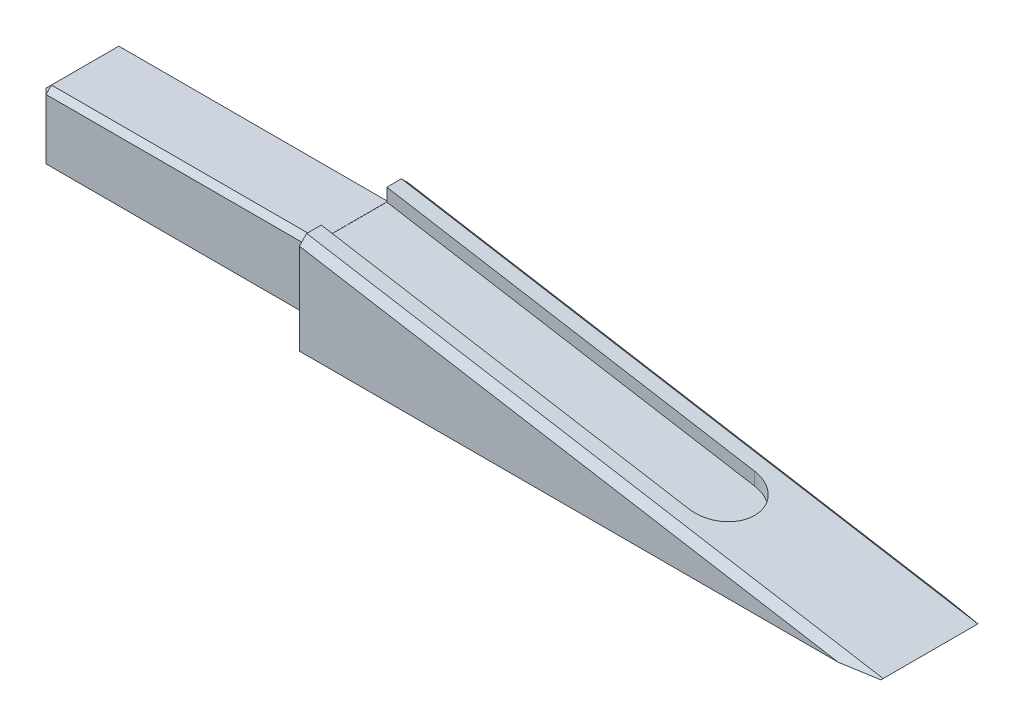
ISO-10303-21;
HEADER;
FILE_DESCRIPTION(('STEP AP214'),'2;1');
FILE_NAME('part.step','',(''),(''),'','','');
FILE_SCHEMA(('AUTOMOTIVE_DESIGN { 1 0 10303 214 1 1 1 1 }'));
ENDSEC;
DATA;
#1=APPLICATION_CONTEXT('core data for automotive mechanical design processes');
#2=APPLICATION_PROTOCOL_DEFINITION('international standard','automotive_design',2000,#1);
#3=PRODUCT_CONTEXT('',#1,'mechanical');
#4=PRODUCT('Part','Part','',(#3));
#5=PRODUCT_RELATED_PRODUCT_CATEGORY('part','',(#4));
#6=PRODUCT_DEFINITION_FORMATION('','',#4);
#7=PRODUCT_DEFINITION_CONTEXT('part definition',#1,'design');
#8=PRODUCT_DEFINITION('design','',#6,#7);
#9=PRODUCT_DEFINITION_SHAPE('','',#8);
#10=(LENGTH_UNIT() NAMED_UNIT(*) SI_UNIT(.MILLI.,.METRE.));
#11=(NAMED_UNIT(*) PLANE_ANGLE_UNIT() SI_UNIT($,.RADIAN.));
#12=(NAMED_UNIT(*) SI_UNIT($,.STERADIAN.) SOLID_ANGLE_UNIT());
#13=UNCERTAINTY_MEASURE_WITH_UNIT(LENGTH_MEASURE(1.E-05),#10,'distance_accuracy_value','');
#14=(GEOMETRIC_REPRESENTATION_CONTEXT(3) GLOBAL_UNCERTAINTY_ASSIGNED_CONTEXT((#13)) GLOBAL_UNIT_ASSIGNED_CONTEXT((#10,
#11,#12)) REPRESENTATION_CONTEXT('',''));
#15=CARTESIAN_POINT('',(0.,0.,0.));
#16=DIRECTION('',(0.,0.,1.));
#17=DIRECTION('',(1.,0.,0.));
#18=AXIS2_PLACEMENT_3D('',#15,#16,#17);
#19=CARTESIAN_POINT('',(50.5,3.2033829137643,0.));
#20=DIRECTION('',(0.,-1.,0.));
#21=DIRECTION('',(0.,0.,-1.));
#22=AXIS2_PLACEMENT_3D('',#19,#20,#21);
#23=CYLINDRICAL_SURFACE('',#22,4.5);
#24=DIRECTION('',(0.,1.,0.));
#25=VECTOR('',#24,1.);
#26=CARTESIAN_POINT('',(50.5,3.2033829137643,-4.5));
#27=LINE('',#26,#25);
#28=CARTESIAN_POINT('',(50.5,3.2033829137643,-4.5));
#29=VERTEX_POINT('',#28);
#30=CARTESIAN_POINT('',(50.5,4.978125,-4.5));
#31=VERTEX_POINT('',#30);
#32=EDGE_CURVE('E199',#29,#31,#27,.T.);
#33=ORIENTED_EDGE('',*,*,#32,.F.);
#34=CARTESIAN_POINT('',(50.5,3.2033829137643,0.));
#35=DIRECTION('',(-0.166397417568639,-0.986058770777122,0.));
#36=DIRECTION('',(0.986058770777122,-0.166397417568639,0.));
#37=AXIS2_PLACEMENT_3D('',#34,#35,#36);
#38=ELLIPSE('',#37,4.56362250746323,4.5);
#39=CARTESIAN_POINT('',(50.5,3.2033829137643,4.5));
#40=VERTEX_POINT('',#39);
#41=EDGE_CURVE('E246',#40,#29,#38,.F.);
#42=ORIENTED_EDGE('',*,*,#41,.F.);
#43=DIRECTION('',(0.,-1.,0.));
#44=VECTOR('',#43,1.);
#45=CARTESIAN_POINT('',(50.5,0.,4.5));
#46=LINE('',#45,#44);
#47=CARTESIAN_POINT('',(50.5,4.978125,4.5));
#48=VERTEX_POINT('',#47);
#49=EDGE_CURVE('E242',#48,#40,#46,.T.);
#50=ORIENTED_EDGE('',*,*,#49,.F.);
#51=CARTESIAN_POINT('',(50.5,4.978125,0.));
#52=DIRECTION('',(-0.166397417568639,-0.986058770777122,0.));
#53=DIRECTION('',(0.986058770777122,-0.166397417568639,0.));
#54=AXIS2_PLACEMENT_3D('',#51,#52,#53);
#55=ELLIPSE('',#54,4.56362250746323,4.5);
#56=EDGE_CURVE('E249',#48,#31,#55,.F.);
#57=ORIENTED_EDGE('',*,*,#56,.T.);
#58=EDGE_LOOP('',(#33,#42,#50,#57));
#59=FACE_BOUND('',#58,.T.);
#60=ADVANCED_FACE('F47',(#59),#23,.F.);
#61=CARTESIAN_POINT('',(0.,0.,7.5));
#62=DIRECTION('',(1.,0.,0.));
#63=DIRECTION('',(0.,0.,-1.));
#64=AXIS2_PLACEMENT_3D('',#61,#62,#63);
#65=PLANE('',#64);
#66=DIRECTION('',(0.,0.,-1.));
#67=VECTOR('',#66,1.);
#68=CARTESIAN_POINT('',(0.,13.5,7.5));
#69=LINE('',#68,#67);
#70=CARTESIAN_POINT('',(0.,13.5,-4.5));
#71=VERTEX_POINT('',#70);
#72=CARTESIAN_POINT('',(0.,13.5,-6.5));
#73=VERTEX_POINT('',#72);
#74=EDGE_CURVE('E210',#71,#73,#69,.T.);
#75=ORIENTED_EDGE('',*,*,#74,.T.);
#76=DIRECTION('',(0.,-0.712052806532872,-0.702125915138204));
#77=VECTOR('',#76,1.);
#78=CARTESIAN_POINT('',(0.,13.5,-6.5));
#79=LINE('',#78,#77);
#80=CARTESIAN_POINT('',(0.,12.4858616650082,-7.5));
#81=VERTEX_POINT('',#80);
#82=EDGE_CURVE('E272',#73,#81,#79,.T.);
#83=ORIENTED_EDGE('',*,*,#82,.T.);
#84=DIRECTION('',(0.,-1.,0.));
#85=VECTOR('',#84,1.);
#86=CARTESIAN_POINT('',(0.,0.,-7.5));
#87=LINE('',#86,#85);
#88=CARTESIAN_POINT('',(0.,0.,-7.5));
#89=VERTEX_POINT('',#88);
#90=EDGE_CURVE('E427',#81,#89,#87,.T.);
#91=ORIENTED_EDGE('',*,*,#90,.T.);
#92=DIRECTION('',(0.,0.,-1.));
#93=VECTOR('',#92,1.);
#94=CARTESIAN_POINT('',(0.,0.,7.5));
#95=LINE('',#94,#93);
#96=CARTESIAN_POINT('',(0.,0.,7.5));
#97=VERTEX_POINT('',#96);
#98=EDGE_CURVE('E228',#97,#89,#95,.T.);
#99=ORIENTED_EDGE('',*,*,#98,.F.);
#100=DIRECTION('',(0.,-1.,0.));
#101=VECTOR('',#100,1.);
#102=CARTESIAN_POINT('',(0.,0.,7.5));
#103=LINE('',#102,#101);
#104=CARTESIAN_POINT('',(0.,12.4858616650082,7.5));
#105=VERTEX_POINT('',#104);
#106=EDGE_CURVE('E231',#105,#97,#103,.T.);
#107=ORIENTED_EDGE('',*,*,#106,.F.);
#108=DIRECTION('',(0.,-0.712052806532872,0.702125915138204));
#109=VECTOR('',#108,1.);
#110=CARTESIAN_POINT('',(0.,12.3105801623066,7.6728378630939));
#111=LINE('',#110,#109);
#112=CARTESIAN_POINT('',(0.,13.5,6.5));
#113=VERTEX_POINT('',#112);
#114=EDGE_CURVE('E269',#105,#113,#111,.F.);
#115=ORIENTED_EDGE('',*,*,#114,.T.);
#116=CARTESIAN_POINT('',(0.,13.5,4.5));
#117=VERTEX_POINT('',#116);
#118=EDGE_CURVE('E222',#113,#117,#69,.T.);
#119=ORIENTED_EDGE('',*,*,#118,.T.);
#120=DIRECTION('',(0.,-1.,0.));
#121=VECTOR('',#120,1.);
#122=CARTESIAN_POINT('',(0.,0.,4.5));
#123=LINE('',#122,#121);
#124=CARTESIAN_POINT('',(0.,11.75,4.5));
#125=VERTEX_POINT('',#124);
#126=EDGE_CURVE('E425',#117,#125,#123,.T.);
#127=ORIENTED_EDGE('',*,*,#126,.T.);
#128=DIRECTION('',(0.,0.,-1.));
#129=VECTOR('',#128,1.);
#130=CARTESIAN_POINT('',(0.,11.75,-5.375));
#131=LINE('',#130,#129);
#132=CARTESIAN_POINT('',(0.,11.75,4.625));
#133=VERTEX_POINT('',#132);
#134=EDGE_CURVE('E419',#133,#125,#131,.T.);
#135=ORIENTED_EDGE('',*,*,#134,.F.);
#136=DIRECTION('',(0.,0.707106781186548,-0.707106781186548));
#137=VECTOR('',#136,1.);
#138=CARTESIAN_POINT('',(0.,4.4375,11.9375));
#139=LINE('',#138,#137);
#140=CARTESIAN_POINT('',(0.,11.,5.375));
#141=VERTEX_POINT('',#140);
#142=EDGE_CURVE('E58',#133,#141,#139,.F.);
#143=ORIENTED_EDGE('',*,*,#142,.T.);
#144=DIRECTION('',(0.,1.,0.));
#145=VECTOR('',#144,1.);
#146=CARTESIAN_POINT('',(0.,2.,5.375));
#147=LINE('',#146,#145);
#148=CARTESIAN_POINT('',(0.,2.75,5.375));
#149=VERTEX_POINT('',#148);
#150=EDGE_CURVE('E436',#149,#141,#147,.T.);
#151=ORIENTED_EDGE('',*,*,#150,.F.);
#152=DIRECTION('',(0.,0.707106781186548,0.707106781186548));
#153=VECTOR('',#152,1.);
#154=CARTESIAN_POINT('',(0.,2.4375,5.0625));
#155=LINE('',#154,#153);
#156=CARTESIAN_POINT('',(0.,2.,4.625));
#157=VERTEX_POINT('',#156);
#158=EDGE_CURVE('E340',#149,#157,#155,.F.);
#159=ORIENTED_EDGE('',*,*,#158,.T.);
#160=DIRECTION('',(0.,0.,1.));
#161=VECTOR('',#160,1.);
#162=CARTESIAN_POINT('',(0.,2.,-5.375));
#163=LINE('',#162,#161);
#164=CARTESIAN_POINT('',(0.,2.,-4.625));
#165=VERTEX_POINT('',#164);
#166=EDGE_CURVE('E437',#165,#157,#163,.T.);
#167=ORIENTED_EDGE('',*,*,#166,.F.);
#168=DIRECTION('',(0.,-0.707106781186548,0.707106781186548));
#169=VECTOR('',#168,1.);
#170=CARTESIAN_POINT('',(0.,-5.0625,2.4375));
#171=LINE('',#170,#169);
#172=CARTESIAN_POINT('',(0.,2.75,-5.375));
#173=VERTEX_POINT('',#172);
#174=EDGE_CURVE('E337',#165,#173,#171,.F.);
#175=ORIENTED_EDGE('',*,*,#174,.T.);
#176=DIRECTION('',(0.,-1.,0.));
#177=VECTOR('',#176,1.);
#178=CARTESIAN_POINT('',(0.,2.,-5.375));
#179=LINE('',#178,#177);
#180=CARTESIAN_POINT('',(0.,11.,-5.375));
#181=VERTEX_POINT('',#180);
#182=EDGE_CURVE('E442',#181,#173,#179,.T.);
#183=ORIENTED_EDGE('',*,*,#182,.F.);
#184=DIRECTION('',(0.,-0.707106781186548,-0.707106781186548));
#185=VECTOR('',#184,1.);
#186=CARTESIAN_POINT('',(0.,11.9375,-4.4375));
#187=LINE('',#186,#185);
#188=CARTESIAN_POINT('',(0.,11.75,-4.625));
#189=VERTEX_POINT('',#188);
#190=EDGE_CURVE('E11',#181,#189,#187,.F.);
#191=ORIENTED_EDGE('',*,*,#190,.T.);
#192=CARTESIAN_POINT('',(0.,11.75,-4.5));
#193=VERTEX_POINT('',#192);
#194=EDGE_CURVE('E212',#193,#189,#131,.T.);
#195=ORIENTED_EDGE('',*,*,#194,.F.);
#196=DIRECTION('',(0.,-1.,0.));
#197=VECTOR('',#196,1.);
#198=CARTESIAN_POINT('',(0.,0.,-4.5));
#199=LINE('',#198,#197);
#200=EDGE_CURVE('E196',#71,#193,#199,.T.);
#201=ORIENTED_EDGE('',*,*,#200,.F.);
#202=EDGE_LOOP('',(#75,#83,#91,#99,#107,#115,#119,#127,#135,#143,#151,#159,#167,#175,#183,#191,
#195,#201));
#203=FACE_BOUND('',#202,.T.);
#204=ADVANCED_FACE('F209',(#203),#65,.F.);
#205=CARTESIAN_POINT('',(0.,13.5,7.5));
#206=DIRECTION('',(-0.166397417568639,-0.986058770777122,0.));
#207=DIRECTION('',(0.986058770777122,-0.166397417568639,0.));
#208=AXIS2_PLACEMENT_3D('',#205,#206,#207);
#209=PLANE('',#208);
#210=DIRECTION('',(0.,0.,-1.));
#211=VECTOR('',#210,1.);
#212=CARTESIAN_POINT('',(79.144385026738,0.144385026737954,7.5));
#213=LINE('',#212,#211);
#214=CARTESIAN_POINT('',(79.144385026738,0.144385026737953,6.5));
#215=VERTEX_POINT('',#214);
#216=CARTESIAN_POINT('',(79.144385026738,0.144385026737953,-6.5));
#217=VERTEX_POINT('',#216);
#218=EDGE_CURVE('E255',#215,#217,#213,.T.);
#219=ORIENTED_EDGE('',*,*,#218,.T.);
#220=DIRECTION('',(-0.986058770777122,0.166397417568639,0.));
#221=VECTOR('',#220,1.);
#222=CARTESIAN_POINT('',(0.,13.5,-6.5));
#223=LINE('',#222,#221);
#224=EDGE_CURVE('E220',#217,#73,#223,.T.);
#225=ORIENTED_EDGE('',*,*,#224,.T.);
#226=ORIENTED_EDGE('',*,*,#74,.F.);
#227=DIRECTION('',(-0.986058770777122,0.166397417568639,0.));
#228=VECTOR('',#227,1.);
#229=CARTESIAN_POINT('',(2.21504804588097,13.1262106422576,-4.5));
#230=LINE('',#229,#228);
#231=EDGE_CURVE('E192',#31,#71,#230,.T.);
#232=ORIENTED_EDGE('',*,*,#231,.F.);
#233=ORIENTED_EDGE('',*,*,#56,.F.);
#234=DIRECTION('',(-0.986058770777122,0.166397417568639,0.));
#235=VECTOR('',#234,1.);
#236=CARTESIAN_POINT('',(2.21504804588097,13.1262106422576,4.5));
#237=LINE('',#236,#235);
#238=EDGE_CURVE('E289',#48,#117,#237,.T.);
#239=ORIENTED_EDGE('',*,*,#238,.T.);
#240=ORIENTED_EDGE('',*,*,#118,.F.);
#241=DIRECTION('',(0.986058770777122,-0.166397417568639,0.));
#242=VECTOR('',#241,1.);
#243=CARTESIAN_POINT('',(0.,13.5,6.5));
#244=LINE('',#243,#242);
#245=EDGE_CURVE('E252',#113,#215,#244,.T.);
#246=ORIENTED_EDGE('',*,*,#245,.T.);
#247=EDGE_LOOP('',(#219,#225,#226,#232,#233,#239,#240,#246));
#248=FACE_BOUND('',#247,.T.);
#249=ADVANCED_FACE('F218',(#248),#209,.F.);
#250=CARTESIAN_POINT('',(0.,0.,7.5));
#251=DIRECTION('',(0.,1.,0.));
#252=DIRECTION('',(0.,0.,1.));
#253=AXIS2_PLACEMENT_3D('',#250,#251,#252);
#254=PLANE('',#253);
#255=DIRECTION('',(1.,0.,0.));
#256=VECTOR('',#255,1.);
#257=CARTESIAN_POINT('',(0.,0.,-7.5));
#258=LINE('',#257,#256);
#259=CARTESIAN_POINT('',(73.9902913481966,0.,-7.5));
#260=VERTEX_POINT('',#259);
#261=EDGE_CURVE('E235',#89,#260,#258,.T.);
#262=ORIENTED_EDGE('',*,*,#261,.T.);
#263=DIRECTION('',(0.986436959807608,0.,0.164140562706246));
#264=VECTOR('',#263,1.);
#265=CARTESIAN_POINT('',(2.15536994604184,0.,-19.4531454125647));
#266=LINE('',#265,#264);
#267=CARTESIAN_POINT('',(79.0000000000001,0.,-6.66639741756863));
#268=VERTEX_POINT('',#267);
#269=EDGE_CURVE('E266',#260,#268,#266,.T.);
#270=ORIENTED_EDGE('',*,*,#269,.T.);
#271=DIRECTION('',(0.,0.,1.));
#272=VECTOR('',#271,1.);
#273=CARTESIAN_POINT('',(79.0000000000001,0.,7.5));
#274=LINE('',#273,#272);
#275=CARTESIAN_POINT('',(79.0000000000001,0.,6.66639741756863));
#276=VERTEX_POINT('',#275);
#277=EDGE_CURVE('E263',#268,#276,#274,.T.);
#278=ORIENTED_EDGE('',*,*,#277,.T.);
#279=DIRECTION('',(0.986436959807608,0.,-0.164140562706246));
#280=VECTOR('',#279,1.);
#281=CARTESIAN_POINT('',(3.98691125676955,0.,19.1483816682893));
#282=LINE('',#281,#280);
#283=CARTESIAN_POINT('',(73.9902913481966,0.,7.5));
#284=VERTEX_POINT('',#283);
#285=EDGE_CURVE('E260',#276,#284,#282,.F.);
#286=ORIENTED_EDGE('',*,*,#285,.T.);
#287=DIRECTION('',(1.,0.,0.));
#288=VECTOR('',#287,1.);
#289=CARTESIAN_POINT('',(0.,0.,7.5));
#290=LINE('',#289,#288);
#291=EDGE_CURVE('E223',#97,#284,#290,.T.);
#292=ORIENTED_EDGE('',*,*,#291,.F.);
#293=ORIENTED_EDGE('',*,*,#98,.T.);
#294=EDGE_LOOP('',(#262,#270,#278,#286,#292,#293));
#295=FACE_BOUND('',#294,.T.);
#296=ADVANCED_FACE('F614',(#295),#254,.F.);
#297=CARTESIAN_POINT('',(0.,0.,7.5));
#298=DIRECTION('',(0.,0.,-1.));
#299=DIRECTION('',(-1.,0.,0.));
#300=AXIS2_PLACEMENT_3D('',#297,#298,#299);
#301=PLANE('',#300);
#302=ORIENTED_EDGE('',*,*,#291,.T.);
#303=DIRECTION('',(-0.986058770777122,0.166397417568639,0.));
#304=VECTOR('',#303,1.);
#305=CARTESIAN_POINT('',(2.04865062831233,12.1401518714805,7.5));
#306=LINE('',#305,#304);
#307=EDGE_CURVE('E278',#284,#105,#306,.T.);
#308=ORIENTED_EDGE('',*,*,#307,.T.);
#309=ORIENTED_EDGE('',*,*,#106,.T.);
#310=EDGE_LOOP('',(#302,#308,#309));
#311=FACE_BOUND('',#310,.T.);
#312=ADVANCED_FACE('F611',(#311),#301,.F.);
#313=CARTESIAN_POINT('',(0.,0.,-7.5));
#314=DIRECTION('',(0.,0.,-1.));
#315=DIRECTION('',(-1.,0.,0.));
#316=AXIS2_PLACEMENT_3D('',#313,#314,#315);
#317=PLANE('',#316);
#318=ORIENTED_EDGE('',*,*,#90,.F.);
#319=DIRECTION('',(0.986058770777122,-0.166397417568639,0.));
#320=VECTOR('',#319,1.);
#321=CARTESIAN_POINT('',(79.8336025824314,-0.986058770777123,-7.5));
#322=LINE('',#321,#320);
#323=EDGE_CURVE('E275',#81,#260,#322,.T.);
#324=ORIENTED_EDGE('',*,*,#323,.T.);
#325=ORIENTED_EDGE('',*,*,#261,.F.);
#326=EDGE_LOOP('',(#318,#324,#325));
#327=FACE_BOUND('',#326,.T.);
#328=ADVANCED_FACE('F607',(#327),#317,.T.);
#329=CARTESIAN_POINT('',(-37.67,2.,-5.375));
#330=DIRECTION('',(0.,0.,1.));
#331=DIRECTION('',(1.,0.,0.));
#332=AXIS2_PLACEMENT_3D('',#329,#330,#331);
#333=PLANE('',#332);
#334=ORIENTED_EDGE('',*,*,#182,.T.);
#335=DIRECTION('',(-1.,0.,0.));
#336=VECTOR('',#335,1.);
#337=CARTESIAN_POINT('',(-37.67,2.75,-5.375));
#338=LINE('',#337,#336);
#339=CARTESIAN_POINT('',(-36.92,2.75,-5.375));
#340=VERTEX_POINT('',#339);
#341=EDGE_CURVE('E318',#173,#340,#338,.T.);
#342=ORIENTED_EDGE('',*,*,#341,.T.);
#343=DIRECTION('',(0.,1.,0.));
#344=VECTOR('',#343,1.);
#345=CARTESIAN_POINT('',(-36.92,2.,-5.375));
#346=LINE('',#345,#344);
#347=CARTESIAN_POINT('',(-36.92,11.,-5.375));
#348=VERTEX_POINT('',#347);
#349=EDGE_CURVE('E315',#340,#348,#346,.T.);
#350=ORIENTED_EDGE('',*,*,#349,.T.);
#351=DIRECTION('',(1.,0.,0.));
#352=VECTOR('',#351,1.);
#353=CARTESIAN_POINT('',(-37.67,11.,-5.375));
#354=LINE('',#353,#352);
#355=EDGE_CURVE('E312',#348,#181,#354,.T.);
#356=ORIENTED_EDGE('',*,*,#355,.T.);
#357=EDGE_LOOP('',(#334,#342,#350,#356));
#358=FACE_BOUND('',#357,.T.);
#359=ADVANCED_FACE('F589',(#358),#333,.F.);
#360=CARTESIAN_POINT('',(-37.67,2.,-5.375));
#361=DIRECTION('',(0.,1.,0.));
#362=DIRECTION('',(0.,0.,1.));
#363=AXIS2_PLACEMENT_3D('',#360,#361,#362);
#364=PLANE('',#363);
#365=DIRECTION('',(0.,0.,-1.));
#366=VECTOR('',#365,1.);
#367=CARTESIAN_POINT('',(-36.92,2.,-5.375));
#368=LINE('',#367,#366);
#369=CARTESIAN_POINT('',(-36.92,2.,4.625));
#370=VERTEX_POINT('',#369);
#371=CARTESIAN_POINT('',(-36.92,2.,-4.625));
#372=VERTEX_POINT('',#371);
#373=EDGE_CURVE('E305',#370,#372,#368,.T.);
#374=ORIENTED_EDGE('',*,*,#373,.T.);
#375=DIRECTION('',(1.,0.,0.));
#376=VECTOR('',#375,1.);
#377=CARTESIAN_POINT('',(-37.67,2.,-4.625));
#378=LINE('',#377,#376);
#379=EDGE_CURVE('E309',#372,#165,#378,.T.);
#380=ORIENTED_EDGE('',*,*,#379,.T.);
#381=ORIENTED_EDGE('',*,*,#166,.T.);
#382=DIRECTION('',(-1.,0.,0.));
#383=VECTOR('',#382,1.);
#384=CARTESIAN_POINT('',(-37.67,2.,4.625));
#385=LINE('',#384,#383);
#386=EDGE_CURVE('E302',#157,#370,#385,.T.);
#387=ORIENTED_EDGE('',*,*,#386,.T.);
#388=EDGE_LOOP('',(#374,#380,#381,#387));
#389=FACE_BOUND('',#388,.T.);
#390=ADVANCED_FACE('F600',(#389),#364,.F.);
#391=CARTESIAN_POINT('',(-37.67,2.,5.375));
#392=DIRECTION('',(0.,0.,-1.));
#393=DIRECTION('',(-1.,0.,0.));
#394=AXIS2_PLACEMENT_3D('',#391,#392,#393);
#395=PLANE('',#394);
#396=DIRECTION('',(0.,-1.,0.));
#397=VECTOR('',#396,1.);
#398=CARTESIAN_POINT('',(-36.92,2.,5.375));
#399=LINE('',#398,#397);
#400=CARTESIAN_POINT('',(-36.92,11.,5.375));
#401=VERTEX_POINT('',#400);
#402=CARTESIAN_POINT('',(-36.92,2.75,5.375));
#403=VERTEX_POINT('',#402);
#404=EDGE_CURVE('E324',#401,#403,#399,.T.);
#405=ORIENTED_EDGE('',*,*,#404,.T.);
#406=DIRECTION('',(1.,0.,0.));
#407=VECTOR('',#406,1.);
#408=CARTESIAN_POINT('',(-37.67,2.75,5.375));
#409=LINE('',#408,#407);
#410=EDGE_CURVE('E327',#403,#149,#409,.T.);
#411=ORIENTED_EDGE('',*,*,#410,.T.);
#412=ORIENTED_EDGE('',*,*,#150,.T.);
#413=DIRECTION('',(-1.,0.,0.));
#414=VECTOR('',#413,1.);
#415=CARTESIAN_POINT('',(-37.67,11.,5.375));
#416=LINE('',#415,#414);
#417=EDGE_CURVE('E321',#141,#401,#416,.T.);
#418=ORIENTED_EDGE('',*,*,#417,.T.);
#419=EDGE_LOOP('',(#405,#411,#412,#418));
#420=FACE_BOUND('',#419,.T.);
#421=ADVANCED_FACE('F596',(#420),#395,.F.);
#422=CARTESIAN_POINT('',(-37.67,11.75,-5.375));
#423=DIRECTION('',(0.,-1.,0.));
#424=DIRECTION('',(0.,0.,-1.));
#425=AXIS2_PLACEMENT_3D('',#422,#423,#424);
#426=PLANE('',#425);
#427=DIRECTION('',(0.,0.,1.));
#428=VECTOR('',#427,1.);
#429=CARTESIAN_POINT('',(-36.92,11.75,-5.375));
#430=LINE('',#429,#428);
#431=CARTESIAN_POINT('',(-36.92,11.75,-4.625));
#432=VERTEX_POINT('',#431);
#433=CARTESIAN_POINT('',(-36.92,11.75,4.625));
#434=VERTEX_POINT('',#433);
#435=EDGE_CURVE('E66',#432,#434,#430,.T.);
#436=ORIENTED_EDGE('',*,*,#435,.T.);
#437=DIRECTION('',(1.,0.,0.));
#438=VECTOR('',#437,1.);
#439=CARTESIAN_POINT('',(-37.67,11.75,4.625));
#440=LINE('',#439,#438);
#441=EDGE_CURVE('E334',#434,#133,#440,.T.);
#442=ORIENTED_EDGE('',*,*,#441,.T.);
#443=ORIENTED_EDGE('',*,*,#134,.T.);
#444=EDGE_CURVE('E428',#125,#193,#131,.T.);
#445=ORIENTED_EDGE('',*,*,#444,.T.);
#446=ORIENTED_EDGE('',*,*,#194,.T.);
#447=DIRECTION('',(-1.,0.,0.));
#448=VECTOR('',#447,1.);
#449=CARTESIAN_POINT('',(-37.67,11.75,-4.625));
#450=LINE('',#449,#448);
#451=EDGE_CURVE('E71',#189,#432,#450,.T.);
#452=ORIENTED_EDGE('',*,*,#451,.T.);
#453=EDGE_LOOP('',(#436,#442,#443,#445,#446,#452));
#454=FACE_BOUND('',#453,.T.);
#455=ADVANCED_FACE('F418',(#454),#426,.F.);
#456=CARTESIAN_POINT('',(-37.67,0.,0.));
#457=DIRECTION('',(1.,0.,0.));
#458=DIRECTION('',(0.,0.,-1.));
#459=AXIS2_PLACEMENT_3D('',#456,#457,#458);
#460=PLANE('',#459);
#461=DIRECTION('',(0.,-1.,0.));
#462=VECTOR('',#461,1.);
#463=CARTESIAN_POINT('',(-37.67,0.,-4.625));
#464=LINE('',#463,#462);
#465=CARTESIAN_POINT('',(-37.67,11.,-4.625));
#466=VERTEX_POINT('',#465);
#467=CARTESIAN_POINT('',(-37.67,2.75,-4.625));
#468=VERTEX_POINT('',#467);
#469=EDGE_CURVE('E281',#466,#468,#464,.T.);
#470=ORIENTED_EDGE('',*,*,#469,.T.);
#471=DIRECTION('',(0.,0.,1.));
#472=VECTOR('',#471,1.);
#473=CARTESIAN_POINT('',(-37.67,2.75,0.));
#474=LINE('',#473,#472);
#475=CARTESIAN_POINT('',(-37.67,2.75,4.625));
#476=VERTEX_POINT('',#475);
#477=EDGE_CURVE('E298',#468,#476,#474,.T.);
#478=ORIENTED_EDGE('',*,*,#477,.T.);
#479=DIRECTION('',(0.,1.,0.));
#480=VECTOR('',#479,1.);
#481=CARTESIAN_POINT('',(-37.67,0.,4.625));
#482=LINE('',#481,#480);
#483=CARTESIAN_POINT('',(-37.67,11.,4.625));
#484=VERTEX_POINT('',#483);
#485=EDGE_CURVE('E295',#476,#484,#482,.T.);
#486=ORIENTED_EDGE('',*,*,#485,.T.);
#487=DIRECTION('',(0.,0.,-1.));
#488=VECTOR('',#487,1.);
#489=CARTESIAN_POINT('',(-37.67,11.,0.));
#490=LINE('',#489,#488);
#491=EDGE_CURVE('E292',#484,#466,#490,.T.);
#492=ORIENTED_EDGE('',*,*,#491,.T.);
#493=EDGE_LOOP('',(#470,#478,#486,#492));
#494=FACE_BOUND('',#493,.T.);
#495=ADVANCED_FACE('F401',(#494),#460,.F.);
#496=CARTESIAN_POINT('',(0.,0.,-4.5));
#497=DIRECTION('',(-1.,0.,0.));
#498=DIRECTION('',(0.,0.,1.));
#499=AXIS2_PLACEMENT_3D('',#496,#497,#498);
#500=PLANE('',#499);
#501=CARTESIAN_POINT('',(0.,11.7252579137643,4.5));
#502=VERTEX_POINT('',#501);
#503=EDGE_CURVE('E456',#125,#502,#123,.T.);
#504=ORIENTED_EDGE('',*,*,#503,.T.);
#505=DIRECTION('',(0.,0.,1.));
#506=VECTOR('',#505,1.);
#507=CARTESIAN_POINT('',(0.,11.7252579137643,-4.5));
#508=LINE('',#507,#506);
#509=CARTESIAN_POINT('',(0.,11.7252579137643,-4.5));
#510=VERTEX_POINT('',#509);
#511=EDGE_CURVE('E447',#510,#502,#508,.T.);
#512=ORIENTED_EDGE('',*,*,#511,.F.);
#513=EDGE_CURVE('E203',#193,#510,#199,.T.);
#514=ORIENTED_EDGE('',*,*,#513,.F.);
#515=ORIENTED_EDGE('',*,*,#444,.F.);
#516=EDGE_LOOP('',(#504,#512,#514,#515));
#517=FACE_BOUND('',#516,.T.);
#518=ADVANCED_FACE('F475',(#517),#500,.F.);
#519=CARTESIAN_POINT('',(1.92385256513585,11.4006077933976,-4.5));
#520=DIRECTION('',(-0.166397417568639,-0.986058770777122,0.));
#521=DIRECTION('',(0.986058770777122,-0.166397417568639,0.));
#522=AXIS2_PLACEMENT_3D('',#519,#520,#521);
#523=PLANE('',#522);
#524=DIRECTION('',(0.986058770777122,-0.166397417568639,0.));
#525=VECTOR('',#524,1.);
#526=CARTESIAN_POINT('',(1.92385256513585,11.4006077933976,4.5));
#527=LINE('',#526,#525);
#528=EDGE_CURVE('E204',#502,#40,#527,.T.);
#529=ORIENTED_EDGE('',*,*,#528,.T.);
#530=ORIENTED_EDGE('',*,*,#41,.T.);
#531=DIRECTION('',(0.986058770777122,-0.166397417568639,0.));
#532=VECTOR('',#531,1.);
#533=CARTESIAN_POINT('',(1.92385256513585,11.4006077933976,-4.5));
#534=LINE('',#533,#532);
#535=EDGE_CURVE('E215',#510,#29,#534,.T.);
#536=ORIENTED_EDGE('',*,*,#535,.F.);
#537=ORIENTED_EDGE('',*,*,#511,.T.);
#538=EDGE_LOOP('',(#529,#530,#536,#537));
#539=FACE_BOUND('',#538,.T.);
#540=ADVANCED_FACE('F463',(#539),#523,.F.);
#541=CARTESIAN_POINT('',(0.,0.,-4.5));
#542=DIRECTION('',(0.,0.,1.));
#543=DIRECTION('',(1.,0.,0.));
#544=AXIS2_PLACEMENT_3D('',#541,#542,#543);
#545=PLANE('',#544);
#546=ORIENTED_EDGE('',*,*,#535,.T.);
#547=ORIENTED_EDGE('',*,*,#32,.T.);
#548=ORIENTED_EDGE('',*,*,#231,.T.);
#549=ORIENTED_EDGE('',*,*,#200,.T.);
#550=ORIENTED_EDGE('',*,*,#513,.T.);
#551=EDGE_LOOP('',(#546,#547,#548,#549,#550));
#552=FACE_BOUND('',#551,.T.);
#553=ADVANCED_FACE('F195',(#552),#545,.T.);
#554=CARTESIAN_POINT('',(0.,0.,4.5));
#555=DIRECTION('',(0.,0.,1.));
#556=DIRECTION('',(1.,0.,0.));
#557=AXIS2_PLACEMENT_3D('',#554,#555,#556);
#558=PLANE('',#557);
#559=ORIENTED_EDGE('',*,*,#238,.F.);
#560=ORIENTED_EDGE('',*,*,#49,.T.);
#561=ORIENTED_EDGE('',*,*,#528,.F.);
#562=ORIENTED_EDGE('',*,*,#503,.F.);
#563=ORIENTED_EDGE('',*,*,#126,.F.);
#564=EDGE_LOOP('',(#559,#560,#561,#562,#563));
#565=FACE_BOUND('',#564,.T.);
#566=ADVANCED_FACE('F472',(#565),#558,.F.);
#567=CARTESIAN_POINT('',(2.04865062831233,12.1401518714805,7.5));
#568=DIRECTION('',(-0.117660742334714,-0.697248843464974,-0.707106781186547));
#569=DIRECTION('',(-0.986058770777122,0.166397417568639,0.));
#570=AXIS2_PLACEMENT_3D('',#567,#568,#569);
#571=PLANE('',#570);
#572=ORIENTED_EDGE('',*,*,#307,.F.);
#573=ORIENTED_EDGE('',*,*,#285,.F.);
#574=DIRECTION('',(0.548148475429387,0.548148475429334,-0.631717102640839));
#575=VECTOR('',#574,1.);
#576=CARTESIAN_POINT('',(59.2377345114388,-19.7622654885593,29.441542575591));
#577=LINE('',#576,#575);
#578=EDGE_CURVE('E285',#215,#276,#577,.F.);
#579=ORIENTED_EDGE('',*,*,#578,.F.);
#580=ORIENTED_EDGE('',*,*,#245,.F.);
#581=ORIENTED_EDGE('',*,*,#114,.F.);
#582=EDGE_LOOP('',(#572,#573,#579,#580,#581));
#583=FACE_BOUND('',#582,.T.);
#584=ADVANCED_FACE('F508',(#583),#571,.F.);
#585=CARTESIAN_POINT('',(0.,13.5,-6.5));
#586=DIRECTION('',(0.117660742334714,0.697248843464975,-0.707106781186547));
#587=DIRECTION('',(0.986058770777122,-0.166397417568639,0.));
#588=AXIS2_PLACEMENT_3D('',#585,#586,#587);
#589=PLANE('',#588);
#590=ORIENTED_EDGE('',*,*,#82,.F.);
#591=ORIENTED_EDGE('',*,*,#224,.F.);
#592=DIRECTION('',(0.548148475429386,0.548148475429333,0.631717102640839));
#593=VECTOR('',#592,1.);
#594=CARTESIAN_POINT('',(59.377047028881,-19.6229529711171,-29.2809910027508));
#595=LINE('',#594,#593);
#596=EDGE_CURVE('E282',#268,#217,#595,.T.);
#597=ORIENTED_EDGE('',*,*,#596,.F.);
#598=ORIENTED_EDGE('',*,*,#269,.F.);
#599=ORIENTED_EDGE('',*,*,#323,.F.);
#600=EDGE_LOOP('',(#590,#591,#597,#598,#599));
#601=FACE_BOUND('',#600,.T.);
#602=ADVANCED_FACE('F502',(#601),#589,.T.);
#603=CARTESIAN_POINT('',(79.144385026738,0.144385026737956,7.5));
#604=DIRECTION('',(-0.707106781186514,0.707106781186582,0.));
#605=DIRECTION('',(0.,0.,-1.));
#606=AXIS2_PLACEMENT_3D('',#603,#604,#605);
#607=PLANE('',#606);
#608=ORIENTED_EDGE('',*,*,#578,.T.);
#609=ORIENTED_EDGE('',*,*,#277,.F.);
#610=ORIENTED_EDGE('',*,*,#596,.T.);
#611=ORIENTED_EDGE('',*,*,#218,.F.);
#612=EDGE_LOOP('',(#608,#609,#610,#611));
#613=FACE_BOUND('',#612,.T.);
#614=ADVANCED_FACE('F496',(#613),#607,.F.);
#615=CARTESIAN_POINT('',(-37.67,11.,-5.375));
#616=DIRECTION('',(0.,-0.707106781186547,0.707106781186547));
#617=DIRECTION('',(1.,0.,0.));
#618=AXIS2_PLACEMENT_3D('',#615,#616,#617);
#619=PLANE('',#618);
#620=ORIENTED_EDGE('',*,*,#190,.F.);
#621=ORIENTED_EDGE('',*,*,#355,.F.);
#622=DIRECTION('',(0.,0.707106781186548,0.707106781186548));
#623=VECTOR('',#622,1.);
#624=CARTESIAN_POINT('',(-36.92,11.375,-5.));
#625=LINE('',#624,#623);
#626=EDGE_CURVE('E52',#432,#348,#625,.F.);
#627=ORIENTED_EDGE('',*,*,#626,.F.);
#628=ORIENTED_EDGE('',*,*,#451,.F.);
#629=EDGE_LOOP('',(#620,#621,#627,#628));
#630=FACE_BOUND('',#629,.T.);
#631=ADVANCED_FACE('F50',(#630),#619,.F.);
#632=CARTESIAN_POINT('',(-37.67,11.,0.));
#633=DIRECTION('',(0.707106781186547,-0.707106781186547,0.));
#634=DIRECTION('',(0.,0.,-1.));
#635=AXIS2_PLACEMENT_3D('',#632,#633,#634);
#636=PLANE('',#635);
#637=DIRECTION('',(0.707106781186548,0.707106781186548,0.));
#638=VECTOR('',#637,1.);
#639=CARTESIAN_POINT('',(-37.67,11.,4.625));
#640=LINE('',#639,#638);
#641=EDGE_CURVE('E379',#434,#484,#640,.F.);
#642=ORIENTED_EDGE('',*,*,#641,.F.);
#643=ORIENTED_EDGE('',*,*,#435,.F.);
#644=DIRECTION('',(-0.707106781186548,-0.707106781186548,0.));
#645=VECTOR('',#644,1.);
#646=CARTESIAN_POINT('',(-37.67,11.,-4.625));
#647=LINE('',#646,#645);
#648=EDGE_CURVE('E381',#466,#432,#647,.F.);
#649=ORIENTED_EDGE('',*,*,#648,.F.);
#650=ORIENTED_EDGE('',*,*,#491,.F.);
#651=EDGE_LOOP('',(#642,#643,#649,#650));
#652=FACE_BOUND('',#651,.T.);
#653=ADVANCED_FACE('F407',(#652),#636,.F.);
#654=CARTESIAN_POINT('',(-37.67,11.75,4.625));
#655=DIRECTION('',(0.,-0.707106781186547,-0.707106781186547));
#656=DIRECTION('',(1.,0.,0.));
#657=AXIS2_PLACEMENT_3D('',#654,#655,#656);
#658=PLANE('',#657);
#659=ORIENTED_EDGE('',*,*,#142,.F.);
#660=ORIENTED_EDGE('',*,*,#441,.F.);
#661=DIRECTION('',(0.,-0.707106781186548,0.707106781186548));
#662=VECTOR('',#661,1.);
#663=CARTESIAN_POINT('',(-36.92,11.375,5.));
#664=LINE('',#663,#662);
#665=EDGE_CURVE('E375',#401,#434,#664,.F.);
#666=ORIENTED_EDGE('',*,*,#665,.F.);
#667=ORIENTED_EDGE('',*,*,#417,.F.);
#668=EDGE_LOOP('',(#659,#660,#666,#667));
#669=FACE_BOUND('',#668,.T.);
#670=ADVANCED_FACE('F416',(#669),#658,.F.);
#671=CARTESIAN_POINT('',(-37.67,11.,-4.625));
#672=DIRECTION('',(-0.577350269189626,0.577350269189626,-0.577350269189626));
#673=DIRECTION('',(-0.707106781186548,0.,0.707106781186548));
#674=AXIS2_PLACEMENT_3D('',#671,#672,#673);
#675=PLANE('',#674);
#676=ORIENTED_EDGE('',*,*,#648,.T.);
#677=ORIENTED_EDGE('',*,*,#626,.T.);
#678=DIRECTION('',(0.707106781186548,0.,-0.707106781186548));
#679=VECTOR('',#678,1.);
#680=CARTESIAN_POINT('',(-37.67,11.,-4.625));
#681=LINE('',#680,#679);
#682=EDGE_CURVE('E371',#466,#348,#681,.T.);
#683=ORIENTED_EDGE('',*,*,#682,.F.);
#684=EDGE_LOOP('',(#676,#677,#683));
#685=FACE_BOUND('',#684,.T.);
#686=ADVANCED_FACE('F390',(#685),#675,.T.);
#687=CARTESIAN_POINT('',(-37.67,11.,4.625));
#688=DIRECTION('',(-0.577350269189626,0.577350269189626,0.577350269189626));
#689=DIRECTION('',(0.707106781186548,0.,0.707106781186548));
#690=AXIS2_PLACEMENT_3D('',#687,#688,#689);
#691=PLANE('',#690);
#692=ORIENTED_EDGE('',*,*,#665,.T.);
#693=ORIENTED_EDGE('',*,*,#641,.T.);
#694=DIRECTION('',(-0.707106781186548,0.,-0.707106781186548));
#695=VECTOR('',#694,1.);
#696=CARTESIAN_POINT('',(-37.67,11.,4.625));
#697=LINE('',#696,#695);
#698=EDGE_CURVE('E367',#401,#484,#697,.T.);
#699=ORIENTED_EDGE('',*,*,#698,.F.);
#700=EDGE_LOOP('',(#692,#693,#699));
#701=FACE_BOUND('',#700,.T.);
#702=ADVANCED_FACE('F411',(#701),#691,.T.);
#703=CARTESIAN_POINT('',(-37.67,2.,-4.625));
#704=DIRECTION('',(0.,0.707106781186547,0.707106781186547));
#705=DIRECTION('',(1.,0.,0.));
#706=AXIS2_PLACEMENT_3D('',#703,#704,#705);
#707=PLANE('',#706);
#708=ORIENTED_EDGE('',*,*,#174,.F.);
#709=ORIENTED_EDGE('',*,*,#379,.F.);
#710=DIRECTION('',(0.,0.707106781186547,-0.707106781186547));
#711=VECTOR('',#710,1.);
#712=CARTESIAN_POINT('',(-36.92,2.,-4.625));
#713=LINE('',#712,#711);
#714=EDGE_CURVE('E363',#340,#372,#713,.F.);
#715=ORIENTED_EDGE('',*,*,#714,.F.);
#716=ORIENTED_EDGE('',*,*,#341,.F.);
#717=EDGE_LOOP('',(#708,#709,#715,#716));
#718=FACE_BOUND('',#717,.T.);
#719=ADVANCED_FACE('F556',(#718),#707,.F.);
#720=CARTESIAN_POINT('',(-37.67,0.,-4.625));
#721=DIRECTION('',(0.707106781186547,0.,0.707106781186547));
#722=DIRECTION('',(0.,-1.,0.));
#723=AXIS2_PLACEMENT_3D('',#720,#721,#722);
#724=PLANE('',#723);
#725=ORIENTED_EDGE('',*,*,#682,.T.);
#726=ORIENTED_EDGE('',*,*,#349,.F.);
#727=DIRECTION('',(-0.707106781186548,0.,0.707106781186548));
#728=VECTOR('',#727,1.);
#729=CARTESIAN_POINT('',(-37.295,2.75,-5.));
#730=LINE('',#729,#728);
#731=EDGE_CURVE('E359',#468,#340,#730,.F.);
#732=ORIENTED_EDGE('',*,*,#731,.F.);
#733=ORIENTED_EDGE('',*,*,#469,.F.);
#734=EDGE_LOOP('',(#725,#726,#732,#733));
#735=FACE_BOUND('',#734,.T.);
#736=ADVANCED_FACE('F396',(#735),#724,.F.);
#737=CARTESIAN_POINT('',(-37.67,0.,4.625));
#738=DIRECTION('',(0.707106781186547,0.,-0.707106781186547));
#739=DIRECTION('',(0.,1.,0.));
#740=AXIS2_PLACEMENT_3D('',#737,#738,#739);
#741=PLANE('',#740);
#742=ORIENTED_EDGE('',*,*,#698,.T.);
#743=ORIENTED_EDGE('',*,*,#485,.F.);
#744=DIRECTION('',(0.707106781186548,0.,0.707106781186548));
#745=VECTOR('',#744,1.);
#746=CARTESIAN_POINT('',(-37.67,2.75,4.625));
#747=LINE('',#746,#745);
#748=EDGE_CURVE('E355',#403,#476,#747,.F.);
#749=ORIENTED_EDGE('',*,*,#748,.F.);
#750=ORIENTED_EDGE('',*,*,#404,.F.);
#751=EDGE_LOOP('',(#742,#743,#749,#750));
#752=FACE_BOUND('',#751,.T.);
#753=ADVANCED_FACE('F543',(#752),#741,.F.);
#754=CARTESIAN_POINT('',(-37.67,2.75,5.375));
#755=DIRECTION('',(0.,0.707106781186547,-0.707106781186547));
#756=DIRECTION('',(1.,0.,0.));
#757=AXIS2_PLACEMENT_3D('',#754,#755,#756);
#758=PLANE('',#757);
#759=ORIENTED_EDGE('',*,*,#158,.F.);
#760=ORIENTED_EDGE('',*,*,#410,.F.);
#761=DIRECTION('',(0.,-0.707106781186547,-0.707106781186547));
#762=VECTOR('',#761,1.);
#763=CARTESIAN_POINT('',(-36.92,2.375,5.));
#764=LINE('',#763,#762);
#765=EDGE_CURVE('E351',#370,#403,#764,.F.);
#766=ORIENTED_EDGE('',*,*,#765,.F.);
#767=ORIENTED_EDGE('',*,*,#386,.F.);
#768=EDGE_LOOP('',(#759,#760,#766,#767));
#769=FACE_BOUND('',#768,.T.);
#770=ADVANCED_FACE('F536',(#769),#758,.F.);
#771=CARTESIAN_POINT('',(-36.92,2.,-4.625));
#772=DIRECTION('',(-0.577350269189626,-0.577350269189626,-0.577350269189626));
#773=DIRECTION('',(0.,0.707106781186548,-0.707106781186548));
#774=AXIS2_PLACEMENT_3D('',#771,#772,#773);
#775=PLANE('',#774);
#776=ORIENTED_EDGE('',*,*,#731,.T.);
#777=ORIENTED_EDGE('',*,*,#714,.T.);
#778=DIRECTION('',(0.707106781186547,-0.707106781186547,0.));
#779=VECTOR('',#778,1.);
#780=CARTESIAN_POINT('',(-36.92,2.,-4.625));
#781=LINE('',#780,#779);
#782=EDGE_CURVE('E348',#468,#372,#781,.T.);
#783=ORIENTED_EDGE('',*,*,#782,.F.);
#784=EDGE_LOOP('',(#776,#777,#783));
#785=FACE_BOUND('',#784,.T.);
#786=ADVANCED_FACE('F529',(#785),#775,.T.);
#787=CARTESIAN_POINT('',(-37.67,2.75,4.625));
#788=DIRECTION('',(-0.577350269189626,-0.577350269189626,0.577350269189626));
#789=DIRECTION('',(0.,-0.707106781186548,-0.707106781186548));
#790=AXIS2_PLACEMENT_3D('',#787,#788,#789);
#791=PLANE('',#790);
#792=ORIENTED_EDGE('',*,*,#765,.T.);
#793=ORIENTED_EDGE('',*,*,#748,.T.);
#794=DIRECTION('',(-0.707106781186547,0.707106781186547,0.));
#795=VECTOR('',#794,1.);
#796=CARTESIAN_POINT('',(-37.67,2.75,4.625));
#797=LINE('',#796,#795);
#798=EDGE_CURVE('E345',#370,#476,#797,.T.);
#799=ORIENTED_EDGE('',*,*,#798,.F.);
#800=EDGE_LOOP('',(#792,#793,#799));
#801=FACE_BOUND('',#800,.T.);
#802=ADVANCED_FACE('F522',(#801),#791,.T.);
#803=CARTESIAN_POINT('',(-37.67,2.75,0.));
#804=DIRECTION('',(0.707106781186547,0.707106781186548,0.));
#805=DIRECTION('',(0.,0.,1.));
#806=AXIS2_PLACEMENT_3D('',#803,#804,#805);
#807=PLANE('',#806);
#808=ORIENTED_EDGE('',*,*,#782,.T.);
#809=ORIENTED_EDGE('',*,*,#373,.F.);
#810=ORIENTED_EDGE('',*,*,#798,.T.);
#811=ORIENTED_EDGE('',*,*,#477,.F.);
#812=EDGE_LOOP('',(#808,#809,#810,#811));
#813=FACE_BOUND('',#812,.T.);
#814=ADVANCED_FACE('F516',(#813),#807,.F.);
#815=CLOSED_SHELL('',(#60,#204,#249,#296,#312,#328,#359,#390,#421,#455,#495,#518,#540,#553,#566,
#584,#602,#614,#631,#653,#670,#686,#702,#719,#736,#753,#770,#786,#802,#814));
#816=MANIFOLD_SOLID_BREP('B2',#815);
#817=ADVANCED_BREP_SHAPE_REPRESENTATION('',(#18,#816),#14);
#818=SHAPE_DEFINITION_REPRESENTATION(#9,#817);
ENDSEC;
END-ISO-10303-21;
